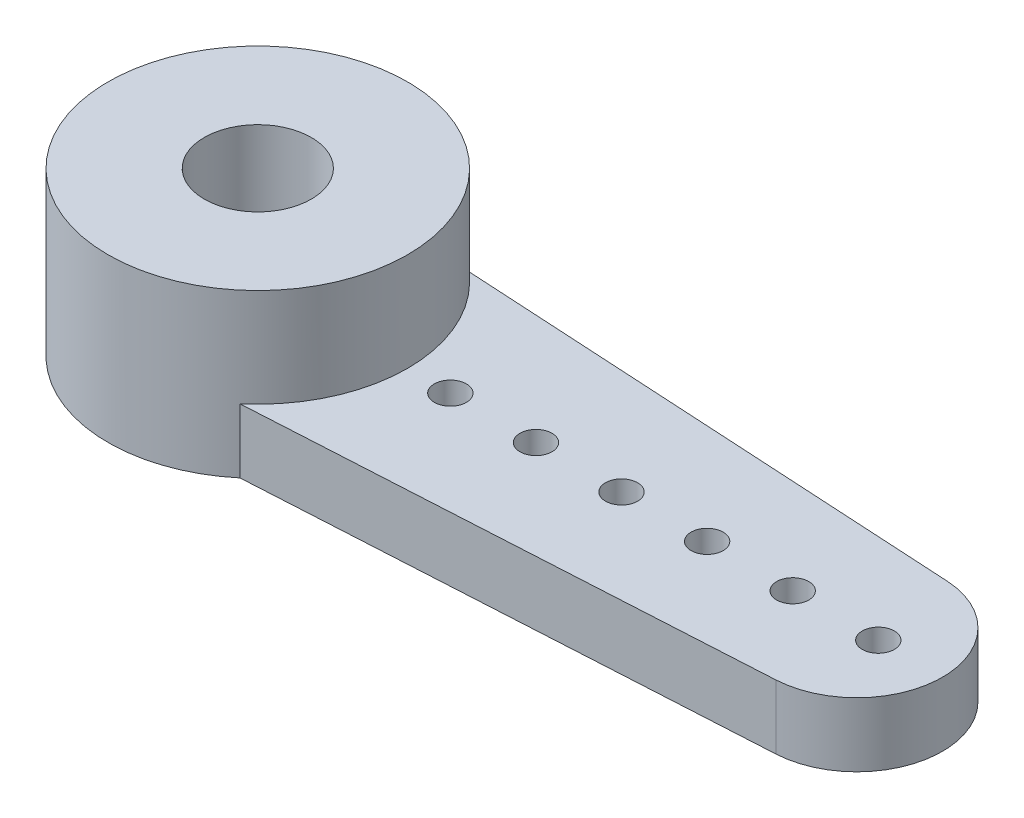
ISO-10303-21;
HEADER;
FILE_DESCRIPTION(('STEP AP214'),'2;1');
FILE_NAME('part.step','',(''),(''),'','','');
FILE_SCHEMA(('AUTOMOTIVE_DESIGN { 1 0 10303 214 1 1 1 1 }'));
ENDSEC;
DATA;
#1=APPLICATION_CONTEXT('core data for automotive mechanical design processes');
#2=APPLICATION_PROTOCOL_DEFINITION('international standard','automotive_design',2000,#1);
#3=PRODUCT_CONTEXT('',#1,'mechanical');
#4=PRODUCT('Part','Part','',(#3));
#5=PRODUCT_RELATED_PRODUCT_CATEGORY('part','',(#4));
#6=PRODUCT_DEFINITION_FORMATION('','',#4);
#7=PRODUCT_DEFINITION_CONTEXT('part definition',#1,'design');
#8=PRODUCT_DEFINITION('design','',#6,#7);
#9=PRODUCT_DEFINITION_SHAPE('','',#8);
#10=(LENGTH_UNIT() NAMED_UNIT(*) SI_UNIT(.MILLI.,.METRE.));
#11=(NAMED_UNIT(*) PLANE_ANGLE_UNIT() SI_UNIT($,.RADIAN.));
#12=(NAMED_UNIT(*) SI_UNIT($,.STERADIAN.) SOLID_ANGLE_UNIT());
#13=UNCERTAINTY_MEASURE_WITH_UNIT(LENGTH_MEASURE(1.E-05),#10,'distance_accuracy_value','');
#14=(GEOMETRIC_REPRESENTATION_CONTEXT(3) GLOBAL_UNCERTAINTY_ASSIGNED_CONTEXT((#13)) GLOBAL_UNIT_ASSIGNED_CONTEXT((#10,
#11,#12)) REPRESENTATION_CONTEXT('',''));
#15=CARTESIAN_POINT('',(0.,0.,0.));
#16=DIRECTION('',(0.,0.,1.));
#17=DIRECTION('',(1.,0.,0.));
#18=AXIS2_PLACEMENT_3D('',#15,#16,#17);
#19=CARTESIAN_POINT('',(0.,1.5,0.));
#20=DIRECTION('',(0.,-1.,0.));
#21=DIRECTION('',(0.,0.,-1.));
#22=AXIS2_PLACEMENT_3D('',#19,#20,#21);
#23=CYLINDRICAL_SURFACE('',#22,3.5);
#24=CARTESIAN_POINT('',(0.,0.,0.));
#25=DIRECTION('',(0.,1.,0.));
#26=DIRECTION('',(0.,0.,1.));
#27=AXIS2_PLACEMENT_3D('',#24,#25,#26);
#28=CIRCLE('',#27,3.5);
#29=CARTESIAN_POINT('',(2.25707221860533,0.,-2.675));
#30=VERTEX_POINT('',#29);
#31=CARTESIAN_POINT('',(2.25707221860533,0.,2.675));
#32=VERTEX_POINT('',#31);
#33=EDGE_CURVE('E89',#30,#32,#28,.T.);
#34=ORIENTED_EDGE('',*,*,#33,.T.);
#35=DIRECTION('',(0.,-1.,0.));
#36=VECTOR('',#35,1.);
#37=CARTESIAN_POINT('',(2.25707221860533,1.5,2.675));
#38=LINE('',#37,#36);
#39=CARTESIAN_POINT('',(2.25707221860533,1.5,2.675));
#40=VERTEX_POINT('',#39);
#41=EDGE_CURVE('E12',#40,#32,#38,.T.);
#42=ORIENTED_EDGE('',*,*,#41,.F.);
#43=CARTESIAN_POINT('',(0.,1.5,0.));
#44=DIRECTION('',(0.,1.,0.));
#45=DIRECTION('',(0.,0.,1.));
#46=AXIS2_PLACEMENT_3D('',#43,#44,#45);
#47=CIRCLE('',#46,3.5);
#48=CARTESIAN_POINT('',(2.25707221860533,1.5,-2.675));
#49=VERTEX_POINT('',#48);
#50=EDGE_CURVE('E87',#40,#49,#47,.T.);
#51=ORIENTED_EDGE('',*,*,#50,.T.);
#52=DIRECTION('',(0.,-1.,0.));
#53=VECTOR('',#52,1.);
#54=CARTESIAN_POINT('',(2.25707221860533,1.5,-2.675));
#55=LINE('',#54,#53);
#56=EDGE_CURVE('E108',#49,#30,#55,.T.);
#57=ORIENTED_EDGE('',*,*,#56,.T.);
#58=EDGE_LOOP('',(#34,#42,#51,#57));
#59=FACE_BOUND('',#58,.T.);
#60=CARTESIAN_POINT('',(0.,3.8,0.));
#61=DIRECTION('',(0.,1.,0.));
#62=DIRECTION('',(0.,0.,1.));
#63=AXIS2_PLACEMENT_3D('',#60,#61,#62);
#64=CIRCLE('',#63,3.5);
#65=CARTESIAN_POINT('',(0.,3.8,3.5));
#66=VERTEX_POINT('',#65);
#67=EDGE_CURVE('E96',#66,#66,#64,.T.);
#68=ORIENTED_EDGE('',*,*,#67,.F.);
#69=EDGE_LOOP('',(#68));
#70=FACE_BOUND('',#69,.T.);
#71=ADVANCED_FACE('F36',(#59,#70),#23,.T.);
#72=CARTESIAN_POINT('',(14.1106495792047,1.5,2.));
#73=DIRECTION('',(-0.0568527304419953,0.,-0.998382575489622));
#74=DIRECTION('',(-0.998382575489622,0.,0.0568527304419953));
#75=AXIS2_PLACEMENT_3D('',#72,#73,#74);
#76=PLANE('',#75);
#77=DIRECTION('',(0.998382575489622,0.,-0.0568527304419953));
#78=VECTOR('',#77,1.);
#79=CARTESIAN_POINT('',(14.1106495792047,0.,2.));
#80=LINE('',#79,#78);
#81=CARTESIAN_POINT('',(14.1106495792047,0.,2.));
#82=VERTEX_POINT('',#81);
#83=EDGE_CURVE('E110',#32,#82,#80,.T.);
#84=ORIENTED_EDGE('',*,*,#83,.T.);
#85=DIRECTION('',(0.,-1.,0.));
#86=VECTOR('',#85,1.);
#87=CARTESIAN_POINT('',(14.1106495792047,1.5,2.));
#88=LINE('',#87,#86);
#89=CARTESIAN_POINT('',(14.1106495792047,1.5,2.));
#90=VERTEX_POINT('',#89);
#91=EDGE_CURVE('E44',#90,#82,#88,.T.);
#92=ORIENTED_EDGE('',*,*,#91,.F.);
#93=DIRECTION('',(0.998382575489622,0.,-0.0568527304419953));
#94=VECTOR('',#93,1.);
#95=CARTESIAN_POINT('',(14.1106495792047,1.5,2.));
#96=LINE('',#95,#94);
#97=EDGE_CURVE('E79',#40,#90,#96,.T.);
#98=ORIENTED_EDGE('',*,*,#97,.F.);
#99=ORIENTED_EDGE('',*,*,#41,.T.);
#100=EDGE_LOOP('',(#84,#92,#98,#99));
#101=FACE_BOUND('',#100,.T.);
#102=ADVANCED_FACE('F91',(#101),#76,.F.);
#103=CARTESIAN_POINT('',(13.9967599103789,1.5,0.));
#104=DIRECTION('',(0.,-1.,0.));
#105=DIRECTION('',(0.,0.,-1.));
#106=AXIS2_PLACEMENT_3D('',#103,#104,#105);
#107=CYLINDRICAL_SURFACE('',#106,2.00324008962113);
#108=CARTESIAN_POINT('',(13.9967599103789,0.,0.));
#109=DIRECTION('',(0.,1.,0.));
#110=DIRECTION('',(0.,0.,-1.));
#111=AXIS2_PLACEMENT_3D('',#108,#109,#110);
#112=CIRCLE('',#111,2.00324008962113);
#113=CARTESIAN_POINT('',(14.1106495792047,0.,-2.));
#114=VERTEX_POINT('',#113);
#115=EDGE_CURVE('E70',#82,#114,#112,.T.);
#116=ORIENTED_EDGE('',*,*,#115,.T.);
#117=DIRECTION('',(0.,-1.,0.));
#118=VECTOR('',#117,1.);
#119=CARTESIAN_POINT('',(14.1106495792047,1.5,-2.));
#120=LINE('',#119,#118);
#121=CARTESIAN_POINT('',(14.1106495792047,1.5,-2.));
#122=VERTEX_POINT('',#121);
#123=EDGE_CURVE('E115',#122,#114,#120,.T.);
#124=ORIENTED_EDGE('',*,*,#123,.F.);
#125=CARTESIAN_POINT('',(13.9967599103789,1.5,0.));
#126=DIRECTION('',(0.,1.,0.));
#127=DIRECTION('',(0.,0.,-1.));
#128=AXIS2_PLACEMENT_3D('',#125,#126,#127);
#129=CIRCLE('',#128,2.00324008962113);
#130=EDGE_CURVE('E93',#90,#122,#129,.T.);
#131=ORIENTED_EDGE('',*,*,#130,.F.);
#132=ORIENTED_EDGE('',*,*,#91,.T.);
#133=EDGE_LOOP('',(#116,#124,#131,#132));
#134=FACE_BOUND('',#133,.T.);
#135=ADVANCED_FACE('F116',(#134),#107,.T.);
#136=CARTESIAN_POINT('',(2.25707221860533,1.5,-2.675));
#137=DIRECTION('',(-0.0568527304419953,0.,0.998382575489622));
#138=DIRECTION('',(0.998382575489622,0.,0.0568527304419953));
#139=AXIS2_PLACEMENT_3D('',#136,#137,#138);
#140=PLANE('',#139);
#141=DIRECTION('',(-0.998382575489622,0.,-0.0568527304419953));
#142=VECTOR('',#141,1.);
#143=CARTESIAN_POINT('',(2.25707221860533,0.,-2.675));
#144=LINE('',#143,#142);
#145=EDGE_CURVE('E75',#114,#30,#144,.T.);
#146=ORIENTED_EDGE('',*,*,#145,.T.);
#147=ORIENTED_EDGE('',*,*,#56,.F.);
#148=DIRECTION('',(-0.998382575489622,0.,-0.0568527304419953));
#149=VECTOR('',#148,1.);
#150=CARTESIAN_POINT('',(2.25707221860533,1.5,-2.675));
#151=LINE('',#150,#149);
#152=EDGE_CURVE('E52',#122,#49,#151,.T.);
#153=ORIENTED_EDGE('',*,*,#152,.F.);
#154=ORIENTED_EDGE('',*,*,#123,.T.);
#155=EDGE_LOOP('',(#146,#147,#153,#154));
#156=FACE_BOUND('',#155,.T.);
#157=ADVANCED_FACE('F130',(#156),#140,.F.);
#158=CARTESIAN_POINT('',(0.,1.5,0.));
#159=DIRECTION('',(0.,1.,0.));
#160=DIRECTION('',(0.,0.,1.));
#161=AXIS2_PLACEMENT_3D('',#158,#159,#160);
#162=PLANE('',#161);
#163=CARTESIAN_POINT('',(4.5,1.5,0.));
#164=DIRECTION('',(0.,1.,0.));
#165=DIRECTION('',(0.,0.,1.));
#166=AXIS2_PLACEMENT_3D('',#163,#164,#165);
#167=CIRCLE('',#166,0.375);
#168=CARTESIAN_POINT('',(4.5,1.5,0.375));
#169=VERTEX_POINT('',#168);
#170=EDGE_CURVE('E97',#169,#169,#167,.T.);
#171=ORIENTED_EDGE('',*,*,#170,.F.);
#172=EDGE_LOOP('',(#171));
#173=FACE_BOUND('',#172,.T.);
#174=CARTESIAN_POINT('',(8.5,1.5,0.));
#175=DIRECTION('',(0.,1.,0.));
#176=DIRECTION('',(0.,0.,1.));
#177=AXIS2_PLACEMENT_3D('',#174,#175,#176);
#178=CIRCLE('',#177,0.375000000000001);
#179=CARTESIAN_POINT('',(8.5,1.5,0.375000000000001));
#180=VERTEX_POINT('',#179);
#181=EDGE_CURVE('E102',#180,#180,#178,.T.);
#182=ORIENTED_EDGE('',*,*,#181,.F.);
#183=EDGE_LOOP('',(#182));
#184=FACE_BOUND('',#183,.T.);
#185=CARTESIAN_POINT('',(10.5,1.5,0.));
#186=DIRECTION('',(0.,1.,0.));
#187=DIRECTION('',(0.,0.,1.));
#188=AXIS2_PLACEMENT_3D('',#185,#186,#187);
#189=CIRCLE('',#188,0.375000000000001);
#190=CARTESIAN_POINT('',(10.5,1.5,0.375000000000001));
#191=VERTEX_POINT('',#190);
#192=EDGE_CURVE('E268',#191,#191,#189,.T.);
#193=ORIENTED_EDGE('',*,*,#192,.F.);
#194=EDGE_LOOP('',(#193));
#195=FACE_BOUND('',#194,.T.);
#196=CARTESIAN_POINT('',(12.5,1.5,0.));
#197=DIRECTION('',(0.,1.,0.));
#198=DIRECTION('',(0.,0.,1.));
#199=AXIS2_PLACEMENT_3D('',#196,#197,#198);
#200=CIRCLE('',#199,0.375000000000001);
#201=CARTESIAN_POINT('',(12.5,1.5,0.375000000000001));
#202=VERTEX_POINT('',#201);
#203=EDGE_CURVE('E265',#202,#202,#200,.T.);
#204=ORIENTED_EDGE('',*,*,#203,.F.);
#205=EDGE_LOOP('',(#204));
#206=FACE_BOUND('',#205,.T.);
#207=CARTESIAN_POINT('',(14.5,1.5,0.));
#208=DIRECTION('',(0.,1.,0.));
#209=DIRECTION('',(0.,0.,1.));
#210=AXIS2_PLACEMENT_3D('',#207,#208,#209);
#211=CIRCLE('',#210,0.374999999999999);
#212=CARTESIAN_POINT('',(14.5,1.5,0.374999999999999));
#213=VERTEX_POINT('',#212);
#214=EDGE_CURVE('E262',#213,#213,#211,.T.);
#215=ORIENTED_EDGE('',*,*,#214,.F.);
#216=EDGE_LOOP('',(#215));
#217=FACE_BOUND('',#216,.T.);
#218=CARTESIAN_POINT('',(6.5,1.5,0.));
#219=DIRECTION('',(0.,1.,0.));
#220=DIRECTION('',(0.,0.,1.));
#221=AXIS2_PLACEMENT_3D('',#218,#219,#220);
#222=CIRCLE('',#221,0.375000000000001);
#223=CARTESIAN_POINT('',(6.5,1.5,0.375000000000001));
#224=VERTEX_POINT('',#223);
#225=EDGE_CURVE('E245',#224,#224,#222,.T.);
#226=ORIENTED_EDGE('',*,*,#225,.F.);
#227=EDGE_LOOP('',(#226));
#228=FACE_BOUND('',#227,.T.);
#229=ORIENTED_EDGE('',*,*,#50,.F.);
#230=ORIENTED_EDGE('',*,*,#97,.T.);
#231=ORIENTED_EDGE('',*,*,#130,.T.);
#232=ORIENTED_EDGE('',*,*,#152,.T.);
#233=EDGE_LOOP('',(#229,#230,#231,#232));
#234=FACE_BOUND('',#233,.T.);
#235=ADVANCED_FACE('F95',(#173,#184,#195,#206,#217,#228,#234),#162,.T.);
#236=CARTESIAN_POINT('',(0.,0.,0.));
#237=DIRECTION('',(0.,1.,0.));
#238=DIRECTION('',(0.,0.,1.));
#239=AXIS2_PLACEMENT_3D('',#236,#237,#238);
#240=PLANE('',#239);
#241=CARTESIAN_POINT('',(4.5,0.,0.));
#242=DIRECTION('',(0.,1.,0.));
#243=DIRECTION('',(0.,0.,1.));
#244=AXIS2_PLACEMENT_3D('',#241,#242,#243);
#245=CIRCLE('',#244,0.375);
#246=CARTESIAN_POINT('',(4.5,0.,0.375));
#247=VERTEX_POINT('',#246);
#248=EDGE_CURVE('E240',#247,#247,#245,.T.);
#249=ORIENTED_EDGE('',*,*,#248,.T.);
#250=EDGE_LOOP('',(#249));
#251=FACE_BOUND('',#250,.T.);
#252=CARTESIAN_POINT('',(8.5,0.,0.));
#253=DIRECTION('',(0.,1.,0.));
#254=DIRECTION('',(0.,0.,1.));
#255=AXIS2_PLACEMENT_3D('',#252,#253,#254);
#256=CIRCLE('',#255,0.375000000000001);
#257=CARTESIAN_POINT('',(8.5,0.,0.375000000000001));
#258=VERTEX_POINT('',#257);
#259=EDGE_CURVE('E242',#258,#258,#256,.T.);
#260=ORIENTED_EDGE('',*,*,#259,.T.);
#261=EDGE_LOOP('',(#260));
#262=FACE_BOUND('',#261,.T.);
#263=CARTESIAN_POINT('',(10.5,0.,0.));
#264=DIRECTION('',(0.,1.,0.));
#265=DIRECTION('',(0.,0.,1.));
#266=AXIS2_PLACEMENT_3D('',#263,#264,#265);
#267=CIRCLE('',#266,0.375000000000001);
#268=CARTESIAN_POINT('',(10.5,0.,0.375000000000001));
#269=VERTEX_POINT('',#268);
#270=EDGE_CURVE('E248',#269,#269,#267,.T.);
#271=ORIENTED_EDGE('',*,*,#270,.T.);
#272=EDGE_LOOP('',(#271));
#273=FACE_BOUND('',#272,.T.);
#274=CARTESIAN_POINT('',(12.5,0.,0.));
#275=DIRECTION('',(0.,1.,0.));
#276=DIRECTION('',(0.,0.,1.));
#277=AXIS2_PLACEMENT_3D('',#274,#275,#276);
#278=CIRCLE('',#277,0.375000000000001);
#279=CARTESIAN_POINT('',(12.5,0.,0.375000000000001));
#280=VERTEX_POINT('',#279);
#281=EDGE_CURVE('E256',#280,#280,#278,.T.);
#282=ORIENTED_EDGE('',*,*,#281,.T.);
#283=EDGE_LOOP('',(#282));
#284=FACE_BOUND('',#283,.T.);
#285=CARTESIAN_POINT('',(14.5,0.,0.));
#286=DIRECTION('',(0.,1.,0.));
#287=DIRECTION('',(0.,0.,1.));
#288=AXIS2_PLACEMENT_3D('',#285,#286,#287);
#289=CIRCLE('',#288,0.374999999999999);
#290=CARTESIAN_POINT('',(14.5,0.,0.374999999999999));
#291=VERTEX_POINT('',#290);
#292=EDGE_CURVE('E258',#291,#291,#289,.T.);
#293=ORIENTED_EDGE('',*,*,#292,.T.);
#294=EDGE_LOOP('',(#293));
#295=FACE_BOUND('',#294,.T.);
#296=CARTESIAN_POINT('',(0.,0.,0.));
#297=DIRECTION('',(0.,1.,0.));
#298=DIRECTION('',(0.,0.,1.));
#299=AXIS2_PLACEMENT_3D('',#296,#297,#298);
#300=CIRCLE('',#299,1.25);
#301=CARTESIAN_POINT('',(0.,0.,1.25));
#302=VERTEX_POINT('',#301);
#303=EDGE_CURVE('E251',#302,#302,#300,.T.);
#304=ORIENTED_EDGE('',*,*,#303,.T.);
#305=EDGE_LOOP('',(#304));
#306=FACE_BOUND('',#305,.T.);
#307=CARTESIAN_POINT('',(6.5,0.,0.));
#308=DIRECTION('',(0.,1.,0.));
#309=DIRECTION('',(0.,0.,1.));
#310=AXIS2_PLACEMENT_3D('',#307,#308,#309);
#311=CIRCLE('',#310,0.375000000000001);
#312=CARTESIAN_POINT('',(6.5,0.,0.375000000000001));
#313=VERTEX_POINT('',#312);
#314=EDGE_CURVE('E241',#313,#313,#311,.T.);
#315=ORIENTED_EDGE('',*,*,#314,.T.);
#316=EDGE_LOOP('',(#315));
#317=FACE_BOUND('',#316,.T.);
#318=ORIENTED_EDGE('',*,*,#33,.F.);
#319=ORIENTED_EDGE('',*,*,#145,.F.);
#320=ORIENTED_EDGE('',*,*,#115,.F.);
#321=ORIENTED_EDGE('',*,*,#83,.F.);
#322=EDGE_LOOP('',(#318,#319,#320,#321));
#323=FACE_BOUND('',#322,.T.);
#324=ADVANCED_FACE('F118',(#251,#262,#273,#284,#295,#306,#317,#323),#240,.F.);
#325=CARTESIAN_POINT('',(0.,3.8,0.));
#326=DIRECTION('',(0.,1.,0.));
#327=DIRECTION('',(0.,0.,1.));
#328=AXIS2_PLACEMENT_3D('',#325,#326,#327);
#329=PLANE('',#328);
#330=CARTESIAN_POINT('',(0.,3.8,0.));
#331=DIRECTION('',(0.,1.,0.));
#332=DIRECTION('',(0.,0.,1.));
#333=AXIS2_PLACEMENT_3D('',#330,#331,#332);
#334=CIRCLE('',#333,1.25);
#335=CARTESIAN_POINT('',(0.,3.8,1.25));
#336=VERTEX_POINT('',#335);
#337=EDGE_CURVE('E291',#336,#336,#334,.T.);
#338=ORIENTED_EDGE('',*,*,#337,.F.);
#339=EDGE_LOOP('',(#338));
#340=FACE_BOUND('',#339,.T.);
#341=ORIENTED_EDGE('',*,*,#67,.T.);
#342=EDGE_LOOP('',(#341));
#343=FACE_BOUND('',#342,.T.);
#344=ADVANCED_FACE('F120',(#340,#343),#329,.T.);
#345=CARTESIAN_POINT('',(0.,0.,0.));
#346=DIRECTION('',(0.,1.,0.));
#347=DIRECTION('',(0.,0.,1.));
#348=AXIS2_PLACEMENT_3D('',#345,#346,#347);
#349=CYLINDRICAL_SURFACE('',#348,1.25);
#350=ORIENTED_EDGE('',*,*,#303,.F.);
#351=EDGE_LOOP('',(#350));
#352=FACE_BOUND('',#351,.T.);
#353=ORIENTED_EDGE('',*,*,#337,.T.);
#354=EDGE_LOOP('',(#353));
#355=FACE_BOUND('',#354,.T.);
#356=ADVANCED_FACE('F127',(#352,#355),#349,.F.);
#357=CARTESIAN_POINT('',(6.5,0.,0.));
#358=DIRECTION('',(0.,1.,0.));
#359=DIRECTION('',(0.,0.,1.));
#360=AXIS2_PLACEMENT_3D('',#357,#358,#359);
#361=CYLINDRICAL_SURFACE('',#360,0.375000000000001);
#362=ORIENTED_EDGE('',*,*,#225,.T.);
#363=EDGE_LOOP('',(#362));
#364=FACE_BOUND('',#363,.T.);
#365=ORIENTED_EDGE('',*,*,#314,.F.);
#366=EDGE_LOOP('',(#365));
#367=FACE_BOUND('',#366,.T.);
#368=ADVANCED_FACE('F173',(#364,#367),#361,.F.);
#369=CARTESIAN_POINT('',(14.5,0.,0.));
#370=DIRECTION('',(0.,1.,0.));
#371=DIRECTION('',(0.,0.,1.));
#372=AXIS2_PLACEMENT_3D('',#369,#370,#371);
#373=CYLINDRICAL_SURFACE('',#372,0.374999999999999);
#374=ORIENTED_EDGE('',*,*,#214,.T.);
#375=EDGE_LOOP('',(#374));
#376=FACE_BOUND('',#375,.T.);
#377=ORIENTED_EDGE('',*,*,#292,.F.);
#378=EDGE_LOOP('',(#377));
#379=FACE_BOUND('',#378,.T.);
#380=ADVANCED_FACE('F183',(#376,#379),#373,.F.);
#381=CARTESIAN_POINT('',(12.5,0.,0.));
#382=DIRECTION('',(0.,1.,0.));
#383=DIRECTION('',(0.,0.,1.));
#384=AXIS2_PLACEMENT_3D('',#381,#382,#383);
#385=CYLINDRICAL_SURFACE('',#384,0.375000000000001);
#386=ORIENTED_EDGE('',*,*,#203,.T.);
#387=EDGE_LOOP('',(#386));
#388=FACE_BOUND('',#387,.T.);
#389=ORIENTED_EDGE('',*,*,#281,.F.);
#390=EDGE_LOOP('',(#389));
#391=FACE_BOUND('',#390,.T.);
#392=ADVANCED_FACE('F193',(#388,#391),#385,.F.);
#393=CARTESIAN_POINT('',(10.5,0.,0.));
#394=DIRECTION('',(0.,1.,0.));
#395=DIRECTION('',(0.,0.,1.));
#396=AXIS2_PLACEMENT_3D('',#393,#394,#395);
#397=CYLINDRICAL_SURFACE('',#396,0.375000000000001);
#398=ORIENTED_EDGE('',*,*,#192,.T.);
#399=EDGE_LOOP('',(#398));
#400=FACE_BOUND('',#399,.T.);
#401=ORIENTED_EDGE('',*,*,#270,.F.);
#402=EDGE_LOOP('',(#401));
#403=FACE_BOUND('',#402,.T.);
#404=ADVANCED_FACE('F203',(#400,#403),#397,.F.);
#405=CARTESIAN_POINT('',(8.5,0.,0.));
#406=DIRECTION('',(0.,1.,0.));
#407=DIRECTION('',(0.,0.,1.));
#408=AXIS2_PLACEMENT_3D('',#405,#406,#407);
#409=CYLINDRICAL_SURFACE('',#408,0.375000000000001);
#410=ORIENTED_EDGE('',*,*,#181,.T.);
#411=EDGE_LOOP('',(#410));
#412=FACE_BOUND('',#411,.T.);
#413=ORIENTED_EDGE('',*,*,#259,.F.);
#414=EDGE_LOOP('',(#413));
#415=FACE_BOUND('',#414,.T.);
#416=ADVANCED_FACE('F213',(#412,#415),#409,.F.);
#417=CARTESIAN_POINT('',(4.5,0.,0.));
#418=DIRECTION('',(0.,1.,0.));
#419=DIRECTION('',(0.,0.,1.));
#420=AXIS2_PLACEMENT_3D('',#417,#418,#419);
#421=CYLINDRICAL_SURFACE('',#420,0.375);
#422=ORIENTED_EDGE('',*,*,#170,.T.);
#423=EDGE_LOOP('',(#422));
#424=FACE_BOUND('',#423,.T.);
#425=ORIENTED_EDGE('',*,*,#248,.F.);
#426=EDGE_LOOP('',(#425));
#427=FACE_BOUND('',#426,.T.);
#428=ADVANCED_FACE('F223',(#424,#427),#421,.F.);
#429=CLOSED_SHELL('',(#71,#102,#135,#157,#235,#324,#344,#356,#368,#380,#392,#404,#416,#428));
#430=MANIFOLD_SOLID_BREP('B2',#429);
#431=ADVANCED_BREP_SHAPE_REPRESENTATION('',(#18,#430),#14);
#432=SHAPE_DEFINITION_REPRESENTATION(#9,#431);
ENDSEC;
END-ISO-10303-21;
